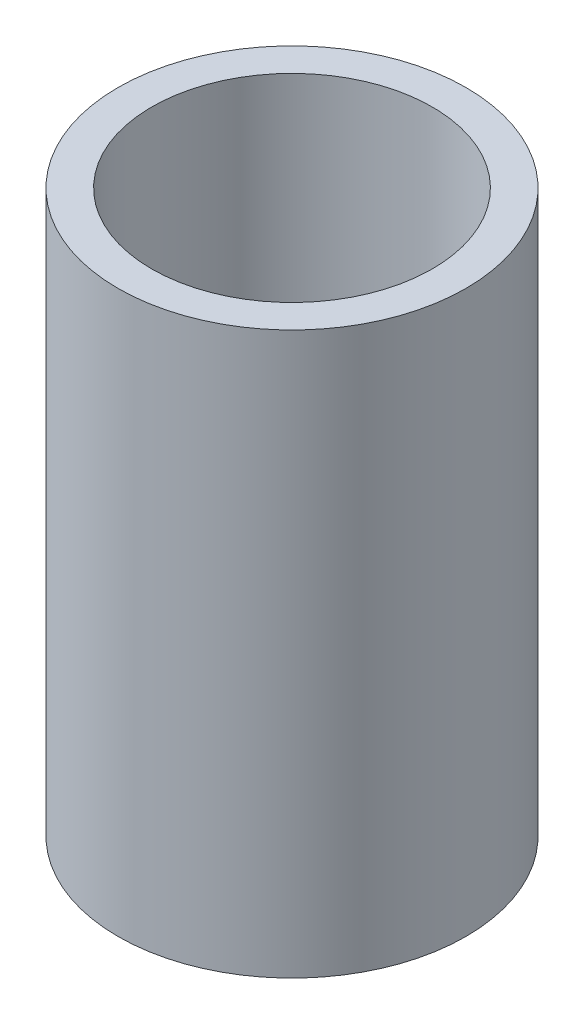
ISO-10303-21;
HEADER;
FILE_DESCRIPTION(('STEP AP214'),'2;1');
FILE_NAME('part.step','',(''),(''),'','','');
FILE_SCHEMA(('AUTOMOTIVE_DESIGN { 1 0 10303 214 1 1 1 1 }'));
ENDSEC;
DATA;
#1=APPLICATION_CONTEXT('core data for automotive mechanical design processes');
#2=APPLICATION_PROTOCOL_DEFINITION('international standard','automotive_design',2000,#1);
#3=PRODUCT_CONTEXT('',#1,'mechanical');
#4=PRODUCT('Part','Part','',(#3));
#5=PRODUCT_RELATED_PRODUCT_CATEGORY('part','',(#4));
#6=PRODUCT_DEFINITION_FORMATION('','',#4);
#7=PRODUCT_DEFINITION_CONTEXT('part definition',#1,'design');
#8=PRODUCT_DEFINITION('design','',#6,#7);
#9=PRODUCT_DEFINITION_SHAPE('','',#8);
#10=(LENGTH_UNIT() NAMED_UNIT(*) SI_UNIT(.MILLI.,.METRE.));
#11=(NAMED_UNIT(*) PLANE_ANGLE_UNIT() SI_UNIT($,.RADIAN.));
#12=(NAMED_UNIT(*) SI_UNIT($,.STERADIAN.) SOLID_ANGLE_UNIT());
#13=UNCERTAINTY_MEASURE_WITH_UNIT(LENGTH_MEASURE(1.E-05),#10,'distance_accuracy_value','');
#14=(GEOMETRIC_REPRESENTATION_CONTEXT(3) GLOBAL_UNCERTAINTY_ASSIGNED_CONTEXT((#13)) GLOBAL_UNIT_ASSIGNED_CONTEXT((#10,
#11,#12)) REPRESENTATION_CONTEXT('',''));
#15=CARTESIAN_POINT('',(0.,0.,0.));
#16=DIRECTION('',(0.,0.,1.));
#17=DIRECTION('',(1.,0.,0.));
#18=AXIS2_PLACEMENT_3D('',#15,#16,#17);
#19=CARTESIAN_POINT('',(0.,50.8,0.));
#20=DIRECTION('',(0.,1.,0.));
#21=DIRECTION('',(0.,0.,1.));
#22=AXIS2_PLACEMENT_3D('',#19,#20,#21);
#23=PLANE('',#22);
#24=CARTESIAN_POINT('',(0.,50.8,0.));
#25=DIRECTION('',(0.,1.,0.));
#26=DIRECTION('',(0.,0.,1.));
#27=AXIS2_PLACEMENT_3D('',#24,#25,#26);
#28=CIRCLE('',#27,15.748);
#29=CARTESIAN_POINT('',(0.,50.8,15.748));
#30=VERTEX_POINT('',#29);
#31=EDGE_CURVE('E12',#30,#30,#28,.T.);
#32=ORIENTED_EDGE('',*,*,#31,.T.);
#33=EDGE_LOOP('',(#32));
#34=FACE_BOUND('',#33,.T.);
#35=CARTESIAN_POINT('',(0.,50.8,0.));
#36=DIRECTION('',(0.,1.,0.));
#37=DIRECTION('',(0.,0.,1.));
#38=AXIS2_PLACEMENT_3D('',#35,#36,#37);
#39=CIRCLE('',#38,12.7);
#40=CARTESIAN_POINT('',(0.,50.8,12.7));
#41=VERTEX_POINT('',#40);
#42=EDGE_CURVE('E51',#41,#41,#39,.T.);
#43=ORIENTED_EDGE('',*,*,#42,.F.);
#44=EDGE_LOOP('',(#43));
#45=FACE_BOUND('',#44,.T.);
#46=ADVANCED_FACE('F40',(#34,#45),#23,.T.);
#47=CARTESIAN_POINT('',(0.,0.,0.));
#48=DIRECTION('',(0.,1.,0.));
#49=DIRECTION('',(0.,0.,1.));
#50=AXIS2_PLACEMENT_3D('',#47,#48,#49);
#51=PLANE('',#50);
#52=CARTESIAN_POINT('',(0.,0.,0.));
#53=DIRECTION('',(0.,1.,0.));
#54=DIRECTION('',(0.,0.,1.));
#55=AXIS2_PLACEMENT_3D('',#52,#53,#54);
#56=CIRCLE('',#55,15.748);
#57=CARTESIAN_POINT('',(0.,0.,15.748));
#58=VERTEX_POINT('',#57);
#59=EDGE_CURVE('E44',#58,#58,#56,.T.);
#60=ORIENTED_EDGE('',*,*,#59,.F.);
#61=EDGE_LOOP('',(#60));
#62=FACE_BOUND('',#61,.T.);
#63=CARTESIAN_POINT('',(0.,0.,0.));
#64=DIRECTION('',(0.,1.,0.));
#65=DIRECTION('',(0.,0.,1.));
#66=AXIS2_PLACEMENT_3D('',#63,#64,#65);
#67=CIRCLE('',#66,12.7);
#68=CARTESIAN_POINT('',(0.,0.,12.7));
#69=VERTEX_POINT('',#68);
#70=EDGE_CURVE('E53',#69,#69,#67,.T.);
#71=ORIENTED_EDGE('',*,*,#70,.T.);
#72=EDGE_LOOP('',(#71));
#73=FACE_BOUND('',#72,.T.);
#74=ADVANCED_FACE('F63',(#62,#73),#51,.F.);
#75=CARTESIAN_POINT('',(0.,50.8,0.));
#76=DIRECTION('',(0.,-1.,0.));
#77=DIRECTION('',(0.,0.,-1.));
#78=AXIS2_PLACEMENT_3D('',#75,#76,#77);
#79=CYLINDRICAL_SURFACE('',#78,15.748);
#80=ORIENTED_EDGE('',*,*,#31,.F.);
#81=EDGE_LOOP('',(#80));
#82=FACE_BOUND('',#81,.T.);
#83=ORIENTED_EDGE('',*,*,#59,.T.);
#84=EDGE_LOOP('',(#83));
#85=FACE_BOUND('',#84,.T.);
#86=ADVANCED_FACE('F42',(#82,#85),#79,.T.);
#87=CARTESIAN_POINT('',(0.,50.8,0.));
#88=DIRECTION('',(0.,-1.,0.));
#89=DIRECTION('',(0.,0.,-1.));
#90=AXIS2_PLACEMENT_3D('',#87,#88,#89);
#91=CYLINDRICAL_SURFACE('',#90,12.7);
#92=ORIENTED_EDGE('',*,*,#42,.T.);
#93=EDGE_LOOP('',(#92));
#94=FACE_BOUND('',#93,.T.);
#95=ORIENTED_EDGE('',*,*,#70,.F.);
#96=EDGE_LOOP('',(#95));
#97=FACE_BOUND('',#96,.T.);
#98=ADVANCED_FACE('F59',(#94,#97),#91,.F.);
#99=CLOSED_SHELL('',(#46,#74,#86,#98));
#100=MANIFOLD_SOLID_BREP('B2',#99);
#101=ADVANCED_BREP_SHAPE_REPRESENTATION('',(#18,#100),#14);
#102=SHAPE_DEFINITION_REPRESENTATION(#9,#101);
ENDSEC;
END-ISO-10303-21;
